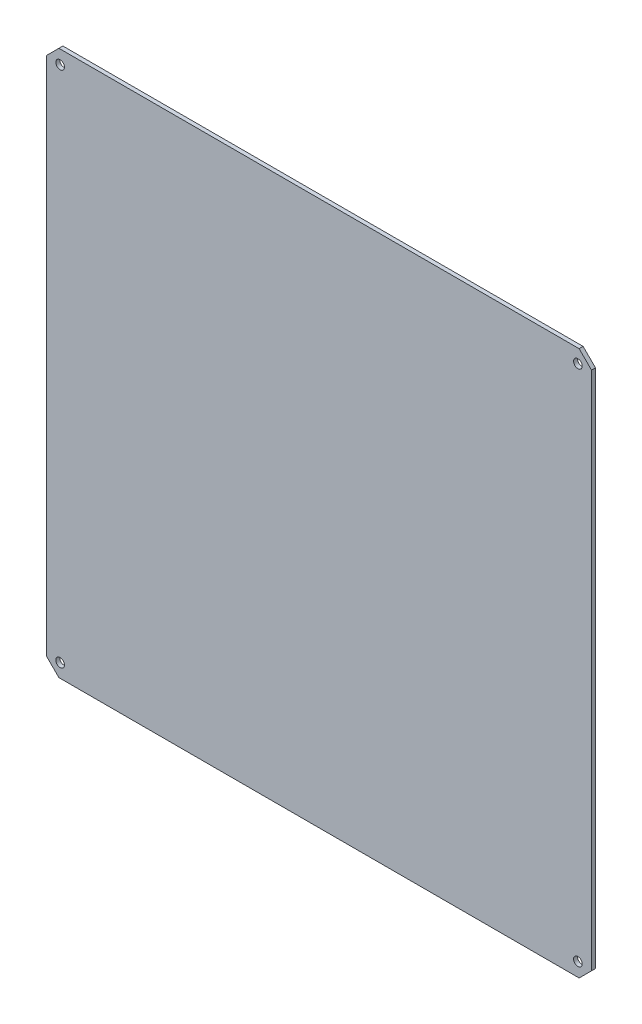
ISO-10303-21;
HEADER;
FILE_DESCRIPTION(('STEP AP214'),'2;1');
FILE_NAME('part.step','',(''),(''),'','','');
FILE_SCHEMA(('AUTOMOTIVE_DESIGN { 1 0 10303 214 1 1 1 1 }'));
ENDSEC;
DATA;
#1=APPLICATION_CONTEXT('core data for automotive mechanical design processes');
#2=APPLICATION_PROTOCOL_DEFINITION('international standard','automotive_design',2000,#1);
#3=PRODUCT_CONTEXT('',#1,'mechanical');
#4=PRODUCT('Part','Part','',(#3));
#5=PRODUCT_RELATED_PRODUCT_CATEGORY('part','',(#4));
#6=PRODUCT_DEFINITION_FORMATION('','',#4);
#7=PRODUCT_DEFINITION_CONTEXT('part definition',#1,'design');
#8=PRODUCT_DEFINITION('design','',#6,#7);
#9=PRODUCT_DEFINITION_SHAPE('','',#8);
#10=(LENGTH_UNIT() NAMED_UNIT(*) SI_UNIT(.MILLI.,.METRE.));
#11=(NAMED_UNIT(*) PLANE_ANGLE_UNIT() SI_UNIT($,.RADIAN.));
#12=(NAMED_UNIT(*) SI_UNIT($,.STERADIAN.) SOLID_ANGLE_UNIT());
#13=UNCERTAINTY_MEASURE_WITH_UNIT(LENGTH_MEASURE(1.E-05),#10,'distance_accuracy_value','');
#14=(GEOMETRIC_REPRESENTATION_CONTEXT(3) GLOBAL_UNCERTAINTY_ASSIGNED_CONTEXT((#13)) GLOBAL_UNIT_ASSIGNED_CONTEXT((#10,
#11,#12)) REPRESENTATION_CONTEXT('',''));
#15=CARTESIAN_POINT('',(0.,0.,0.));
#16=DIRECTION('',(0.,0.,1.));
#17=DIRECTION('',(1.,0.,0.));
#18=AXIS2_PLACEMENT_3D('',#15,#16,#17);
#19=CARTESIAN_POINT('',(0.,0.,1.6));
#20=DIRECTION('',(0.,0.,-1.));
#21=DIRECTION('',(-1.,0.,0.));
#22=AXIS2_PLACEMENT_3D('',#19,#20,#21);
#23=PLANE('',#22);
#24=DIRECTION('',(0.,-1.,0.));
#25=VECTOR('',#24,1.);
#26=CARTESIAN_POINT('',(-110.,-110.,1.6));
#27=LINE('',#26,#25);
#28=CARTESIAN_POINT('',(-110.,105.,1.6));
#29=VERTEX_POINT('',#28);
#30=CARTESIAN_POINT('',(-110.,-105.,1.6));
#31=VERTEX_POINT('',#30);
#32=EDGE_CURVE('E165',#29,#31,#27,.T.);
#33=ORIENTED_EDGE('',*,*,#32,.T.);
#34=DIRECTION('',(-0.707106781186546,0.707106781186549,0.));
#35=VECTOR('',#34,1.);
#36=CARTESIAN_POINT('',(-105.,-110.,1.6));
#37=LINE('',#36,#35);
#38=CARTESIAN_POINT('',(-105.,-110.,1.6));
#39=VERTEX_POINT('',#38);
#40=EDGE_CURVE('E148',#31,#39,#37,.F.);
#41=ORIENTED_EDGE('',*,*,#40,.T.);
#42=DIRECTION('',(1.,0.,0.));
#43=VECTOR('',#42,1.);
#44=CARTESIAN_POINT('',(-110.,-110.,1.6));
#45=LINE('',#44,#43);
#46=CARTESIAN_POINT('',(105.,-110.,1.6));
#47=VERTEX_POINT('',#46);
#48=EDGE_CURVE('E119',#39,#47,#45,.T.);
#49=ORIENTED_EDGE('',*,*,#48,.T.);
#50=DIRECTION('',(-0.70710678118655,-0.707106781186545,0.));
#51=VECTOR('',#50,1.);
#52=CARTESIAN_POINT('',(110.,-105.,1.6));
#53=LINE('',#52,#51);
#54=CARTESIAN_POINT('',(110.,-105.,1.6));
#55=VERTEX_POINT('',#54);
#56=EDGE_CURVE('E146',#47,#55,#53,.F.);
#57=ORIENTED_EDGE('',*,*,#56,.T.);
#58=DIRECTION('',(0.,1.,0.));
#59=VECTOR('',#58,1.);
#60=CARTESIAN_POINT('',(110.,-110.,1.6));
#61=LINE('',#60,#59);
#62=CARTESIAN_POINT('',(110.,105.,1.6));
#63=VERTEX_POINT('',#62);
#64=EDGE_CURVE('E126',#55,#63,#61,.T.);
#65=ORIENTED_EDGE('',*,*,#64,.T.);
#66=DIRECTION('',(0.707106781186546,-0.707106781186549,0.));
#67=VECTOR('',#66,1.);
#68=CARTESIAN_POINT('',(105.,110.,1.6));
#69=LINE('',#68,#67);
#70=CARTESIAN_POINT('',(105.,110.,1.6));
#71=VERTEX_POINT('',#70);
#72=EDGE_CURVE('E54',#63,#71,#69,.F.);
#73=ORIENTED_EDGE('',*,*,#72,.T.);
#74=DIRECTION('',(-1.,0.,0.));
#75=VECTOR('',#74,1.);
#76=CARTESIAN_POINT('',(-110.,110.,1.6));
#77=LINE('',#76,#75);
#78=CARTESIAN_POINT('',(-105.,110.,1.6));
#79=VERTEX_POINT('',#78);
#80=EDGE_CURVE('E129',#71,#79,#77,.T.);
#81=ORIENTED_EDGE('',*,*,#80,.T.);
#82=DIRECTION('',(0.707106781186549,0.707106781186546,0.));
#83=VECTOR('',#82,1.);
#84=CARTESIAN_POINT('',(-110.,105.,1.6));
#85=LINE('',#84,#83);
#86=EDGE_CURVE('E144',#79,#29,#85,.F.);
#87=ORIENTED_EDGE('',*,*,#86,.T.);
#88=EDGE_LOOP('',(#33,#41,#49,#57,#65,#73,#81,#87));
#89=FACE_BOUND('',#88,.T.);
#90=CARTESIAN_POINT('',(104.5,104.5,1.6));
#91=DIRECTION('',(0.,0.,1.));
#92=DIRECTION('',(1.,0.,0.));
#93=AXIS2_PLACEMENT_3D('',#90,#91,#92);
#94=CIRCLE('',#93,1.75);
#95=CARTESIAN_POINT('',(106.25,104.5,1.6));
#96=VERTEX_POINT('',#95);
#97=EDGE_CURVE('E161',#96,#96,#94,.T.);
#98=ORIENTED_EDGE('',*,*,#97,.F.);
#99=EDGE_LOOP('',(#98));
#100=FACE_BOUND('',#99,.T.);
#101=CARTESIAN_POINT('',(-104.5,104.5,1.6));
#102=DIRECTION('',(0.,0.,1.));
#103=DIRECTION('',(1.,0.,0.));
#104=AXIS2_PLACEMENT_3D('',#101,#102,#103);
#105=CIRCLE('',#104,1.75);
#106=CARTESIAN_POINT('',(-102.75,104.5,1.6));
#107=VERTEX_POINT('',#106);
#108=EDGE_CURVE('E172',#107,#107,#105,.T.);
#109=ORIENTED_EDGE('',*,*,#108,.F.);
#110=EDGE_LOOP('',(#109));
#111=FACE_BOUND('',#110,.T.);
#112=CARTESIAN_POINT('',(-104.5,-104.5,1.6));
#113=DIRECTION('',(0.,0.,1.));
#114=DIRECTION('',(1.,0.,0.));
#115=AXIS2_PLACEMENT_3D('',#112,#113,#114);
#116=CIRCLE('',#115,1.75);
#117=CARTESIAN_POINT('',(-102.75,-104.5,1.6));
#118=VERTEX_POINT('',#117);
#119=EDGE_CURVE('E178',#118,#118,#116,.T.);
#120=ORIENTED_EDGE('',*,*,#119,.F.);
#121=EDGE_LOOP('',(#120));
#122=FACE_BOUND('',#121,.T.);
#123=CARTESIAN_POINT('',(104.5,-104.5,1.6));
#124=DIRECTION('',(0.,0.,1.));
#125=DIRECTION('',(1.,0.,0.));
#126=AXIS2_PLACEMENT_3D('',#123,#124,#125);
#127=CIRCLE('',#126,1.75);
#128=CARTESIAN_POINT('',(106.25,-104.5,1.6));
#129=VERTEX_POINT('',#128);
#130=EDGE_CURVE('E184',#129,#129,#127,.T.);
#131=ORIENTED_EDGE('',*,*,#130,.F.);
#132=EDGE_LOOP('',(#131));
#133=FACE_BOUND('',#132,.T.);
#134=ADVANCED_FACE('F34',(#89,#100,#111,#122,#133),#23,.F.);
#135=CARTESIAN_POINT('',(0.,0.,0.));
#136=DIRECTION('',(0.,0.,-1.));
#137=DIRECTION('',(-1.,0.,0.));
#138=AXIS2_PLACEMENT_3D('',#135,#136,#137);
#139=PLANE('',#138);
#140=CARTESIAN_POINT('',(-104.5,-104.5,0.));
#141=DIRECTION('',(0.,0.,1.));
#142=DIRECTION('',(1.,0.,0.));
#143=AXIS2_PLACEMENT_3D('',#140,#141,#142);
#144=CIRCLE('',#143,1.75);
#145=CARTESIAN_POINT('',(-102.75,-104.5,0.));
#146=VERTEX_POINT('',#145);
#147=EDGE_CURVE('E181',#146,#146,#144,.T.);
#148=ORIENTED_EDGE('',*,*,#147,.T.);
#149=EDGE_LOOP('',(#148));
#150=FACE_BOUND('',#149,.T.);
#151=CARTESIAN_POINT('',(104.5,104.5,0.));
#152=DIRECTION('',(0.,0.,1.));
#153=DIRECTION('',(1.,0.,0.));
#154=AXIS2_PLACEMENT_3D('',#151,#152,#153);
#155=CIRCLE('',#154,1.75);
#156=CARTESIAN_POINT('',(106.25,104.5,0.));
#157=VERTEX_POINT('',#156);
#158=EDGE_CURVE('E169',#157,#157,#155,.T.);
#159=ORIENTED_EDGE('',*,*,#158,.T.);
#160=EDGE_LOOP('',(#159));
#161=FACE_BOUND('',#160,.T.);
#162=DIRECTION('',(1.,0.,0.));
#163=VECTOR('',#162,1.);
#164=CARTESIAN_POINT('',(-110.,-110.,0.));
#165=LINE('',#164,#163);
#166=CARTESIAN_POINT('',(-105.,-110.,0.));
#167=VERTEX_POINT('',#166);
#168=CARTESIAN_POINT('',(105.,-110.,0.));
#169=VERTEX_POINT('',#168);
#170=EDGE_CURVE('E116',#167,#169,#165,.T.);
#171=ORIENTED_EDGE('',*,*,#170,.F.);
#172=DIRECTION('',(0.707106781186546,-0.707106781186549,0.));
#173=VECTOR('',#172,1.);
#174=CARTESIAN_POINT('',(-107.5,-107.5,0.));
#175=LINE('',#174,#173);
#176=CARTESIAN_POINT('',(-110.,-105.,0.));
#177=VERTEX_POINT('',#176);
#178=EDGE_CURVE('E99',#167,#177,#175,.F.);
#179=ORIENTED_EDGE('',*,*,#178,.T.);
#180=DIRECTION('',(0.,-1.,0.));
#181=VECTOR('',#180,1.);
#182=CARTESIAN_POINT('',(-110.,-110.,0.));
#183=LINE('',#182,#181);
#184=CARTESIAN_POINT('',(-110.,105.,0.));
#185=VERTEX_POINT('',#184);
#186=EDGE_CURVE('E127',#185,#177,#183,.T.);
#187=ORIENTED_EDGE('',*,*,#186,.F.);
#188=DIRECTION('',(-0.707106781186549,-0.707106781186546,0.));
#189=VECTOR('',#188,1.);
#190=CARTESIAN_POINT('',(-107.5,107.5,0.));
#191=LINE('',#190,#189);
#192=CARTESIAN_POINT('',(-105.,110.,0.));
#193=VERTEX_POINT('',#192);
#194=EDGE_CURVE('E137',#185,#193,#191,.F.);
#195=ORIENTED_EDGE('',*,*,#194,.T.);
#196=DIRECTION('',(-1.,0.,0.));
#197=VECTOR('',#196,1.);
#198=CARTESIAN_POINT('',(-110.,110.,0.));
#199=LINE('',#198,#197);
#200=CARTESIAN_POINT('',(105.,110.,0.));
#201=VERTEX_POINT('',#200);
#202=EDGE_CURVE('E131',#201,#193,#199,.T.);
#203=ORIENTED_EDGE('',*,*,#202,.F.);
#204=DIRECTION('',(-0.707106781186546,0.707106781186549,0.));
#205=VECTOR('',#204,1.);
#206=CARTESIAN_POINT('',(107.5,107.5,0.));
#207=LINE('',#206,#205);
#208=CARTESIAN_POINT('',(110.,105.,0.));
#209=VERTEX_POINT('',#208);
#210=EDGE_CURVE('E120',#201,#209,#207,.F.);
#211=ORIENTED_EDGE('',*,*,#210,.T.);
#212=DIRECTION('',(0.,1.,0.));
#213=VECTOR('',#212,1.);
#214=CARTESIAN_POINT('',(110.,-110.,0.));
#215=LINE('',#214,#213);
#216=CARTESIAN_POINT('',(110.,-105.,0.));
#217=VERTEX_POINT('',#216);
#218=EDGE_CURVE('E160',#217,#209,#215,.T.);
#219=ORIENTED_EDGE('',*,*,#218,.F.);
#220=DIRECTION('',(0.70710678118655,0.707106781186545,0.));
#221=VECTOR('',#220,1.);
#222=CARTESIAN_POINT('',(107.5,-107.5,0.));
#223=LINE('',#222,#221);
#224=EDGE_CURVE('E110',#217,#169,#223,.F.);
#225=ORIENTED_EDGE('',*,*,#224,.T.);
#226=EDGE_LOOP('',(#171,#179,#187,#195,#203,#211,#219,#225));
#227=FACE_BOUND('',#226,.T.);
#228=CARTESIAN_POINT('',(-104.5,104.5,0.));
#229=DIRECTION('',(0.,0.,1.));
#230=DIRECTION('',(1.,0.,0.));
#231=AXIS2_PLACEMENT_3D('',#228,#229,#230);
#232=CIRCLE('',#231,1.75);
#233=CARTESIAN_POINT('',(-102.75,104.5,0.));
#234=VERTEX_POINT('',#233);
#235=EDGE_CURVE('E175',#234,#234,#232,.T.);
#236=ORIENTED_EDGE('',*,*,#235,.T.);
#237=EDGE_LOOP('',(#236));
#238=FACE_BOUND('',#237,.T.);
#239=CARTESIAN_POINT('',(104.5,-104.5,0.));
#240=DIRECTION('',(0.,0.,1.));
#241=DIRECTION('',(1.,0.,0.));
#242=AXIS2_PLACEMENT_3D('',#239,#240,#241);
#243=CIRCLE('',#242,1.75);
#244=CARTESIAN_POINT('',(106.25,-104.5,0.));
#245=VERTEX_POINT('',#244);
#246=EDGE_CURVE('E187',#245,#245,#243,.T.);
#247=ORIENTED_EDGE('',*,*,#246,.T.);
#248=EDGE_LOOP('',(#247));
#249=FACE_BOUND('',#248,.T.);
#250=ADVANCED_FACE('F123',(#150,#161,#227,#238,#249),#139,.T.);
#251=CARTESIAN_POINT('',(110.,-110.,1.6));
#252=DIRECTION('',(-1.,0.,0.));
#253=DIRECTION('',(0.,-1.,0.));
#254=AXIS2_PLACEMENT_3D('',#251,#252,#253);
#255=PLANE('',#254);
#256=ORIENTED_EDGE('',*,*,#64,.F.);
#257=DIRECTION('',(0.,0.,-1.));
#258=VECTOR('',#257,1.);
#259=CARTESIAN_POINT('',(110.,-105.,1.6));
#260=LINE('',#259,#258);
#261=EDGE_CURVE('E152',#55,#217,#260,.T.);
#262=ORIENTED_EDGE('',*,*,#261,.T.);
#263=ORIENTED_EDGE('',*,*,#218,.T.);
#264=DIRECTION('',(0.,0.,1.));
#265=VECTOR('',#264,1.);
#266=CARTESIAN_POINT('',(110.,105.,1.6));
#267=LINE('',#266,#265);
#268=EDGE_CURVE('E150',#209,#63,#267,.T.);
#269=ORIENTED_EDGE('',*,*,#268,.T.);
#270=EDGE_LOOP('',(#256,#262,#263,#269));
#271=FACE_BOUND('',#270,.T.);
#272=ADVANCED_FACE('F201',(#271),#255,.F.);
#273=CARTESIAN_POINT('',(-110.,110.,1.6));
#274=DIRECTION('',(0.,-1.,0.));
#275=DIRECTION('',(1.,0.,0.));
#276=AXIS2_PLACEMENT_3D('',#273,#274,#275);
#277=PLANE('',#276);
#278=ORIENTED_EDGE('',*,*,#202,.T.);
#279=DIRECTION('',(0.,0.,1.));
#280=VECTOR('',#279,1.);
#281=CARTESIAN_POINT('',(-105.,110.,1.6));
#282=LINE('',#281,#280);
#283=EDGE_CURVE('E11',#193,#79,#282,.T.);
#284=ORIENTED_EDGE('',*,*,#283,.T.);
#285=ORIENTED_EDGE('',*,*,#80,.F.);
#286=DIRECTION('',(0.,0.,-1.));
#287=VECTOR('',#286,1.);
#288=CARTESIAN_POINT('',(105.,110.,1.6));
#289=LINE('',#288,#287);
#290=EDGE_CURVE('E42',#71,#201,#289,.T.);
#291=ORIENTED_EDGE('',*,*,#290,.T.);
#292=EDGE_LOOP('',(#278,#284,#285,#291));
#293=FACE_BOUND('',#292,.T.);
#294=ADVANCED_FACE('F157',(#293),#277,.F.);
#295=CARTESIAN_POINT('',(-110.,-110.,1.6));
#296=DIRECTION('',(1.,0.,0.));
#297=DIRECTION('',(0.,0.,-1.));
#298=AXIS2_PLACEMENT_3D('',#295,#296,#297);
#299=PLANE('',#298);
#300=ORIENTED_EDGE('',*,*,#186,.T.);
#301=DIRECTION('',(0.,0.,1.));
#302=VECTOR('',#301,1.);
#303=CARTESIAN_POINT('',(-110.,-105.,1.6));
#304=LINE('',#303,#302);
#305=EDGE_CURVE('E104',#177,#31,#304,.T.);
#306=ORIENTED_EDGE('',*,*,#305,.T.);
#307=ORIENTED_EDGE('',*,*,#32,.F.);
#308=DIRECTION('',(0.,0.,-1.));
#309=VECTOR('',#308,1.);
#310=CARTESIAN_POINT('',(-110.,105.,1.6));
#311=LINE('',#310,#309);
#312=EDGE_CURVE('E109',#29,#185,#311,.T.);
#313=ORIENTED_EDGE('',*,*,#312,.T.);
#314=EDGE_LOOP('',(#300,#306,#307,#313));
#315=FACE_BOUND('',#314,.T.);
#316=ADVANCED_FACE('F211',(#315),#299,.F.);
#317=CARTESIAN_POINT('',(-110.,-110.,1.6));
#318=DIRECTION('',(0.,1.,0.));
#319=DIRECTION('',(0.,0.,1.));
#320=AXIS2_PLACEMENT_3D('',#317,#318,#319);
#321=PLANE('',#320);
#322=ORIENTED_EDGE('',*,*,#48,.F.);
#323=DIRECTION('',(0.,0.,-1.));
#324=VECTOR('',#323,1.);
#325=CARTESIAN_POINT('',(-105.,-110.,1.6));
#326=LINE('',#325,#324);
#327=EDGE_CURVE('E103',#39,#167,#326,.T.);
#328=ORIENTED_EDGE('',*,*,#327,.T.);
#329=ORIENTED_EDGE('',*,*,#170,.T.);
#330=DIRECTION('',(0.,0.,1.));
#331=VECTOR('',#330,1.);
#332=CARTESIAN_POINT('',(105.,-110.,1.6));
#333=LINE('',#332,#331);
#334=EDGE_CURVE('E121',#169,#47,#333,.T.);
#335=ORIENTED_EDGE('',*,*,#334,.T.);
#336=EDGE_LOOP('',(#322,#328,#329,#335));
#337=FACE_BOUND('',#336,.T.);
#338=ADVANCED_FACE('F115',(#337),#321,.F.);
#339=CARTESIAN_POINT('',(104.5,104.5,1.6));
#340=DIRECTION('',(0.,0.,-1.));
#341=DIRECTION('',(-1.,0.,0.));
#342=AXIS2_PLACEMENT_3D('',#339,#340,#341);
#343=CYLINDRICAL_SURFACE('',#342,1.75);
#344=ORIENTED_EDGE('',*,*,#97,.T.);
#345=EDGE_LOOP('',(#344));
#346=FACE_BOUND('',#345,.T.);
#347=ORIENTED_EDGE('',*,*,#158,.F.);
#348=EDGE_LOOP('',(#347));
#349=FACE_BOUND('',#348,.T.);
#350=ADVANCED_FACE('F206',(#346,#349),#343,.F.);
#351=CARTESIAN_POINT('',(-104.5,104.5,1.6));
#352=DIRECTION('',(0.,0.,-1.));
#353=DIRECTION('',(-1.,0.,0.));
#354=AXIS2_PLACEMENT_3D('',#351,#352,#353);
#355=CYLINDRICAL_SURFACE('',#354,1.75);
#356=ORIENTED_EDGE('',*,*,#108,.T.);
#357=EDGE_LOOP('',(#356));
#358=FACE_BOUND('',#357,.T.);
#359=ORIENTED_EDGE('',*,*,#235,.F.);
#360=EDGE_LOOP('',(#359));
#361=FACE_BOUND('',#360,.T.);
#362=ADVANCED_FACE('F310',(#358,#361),#355,.F.);
#363=CARTESIAN_POINT('',(-104.5,-104.5,1.6));
#364=DIRECTION('',(0.,0.,-1.));
#365=DIRECTION('',(-1.,0.,0.));
#366=AXIS2_PLACEMENT_3D('',#363,#364,#365);
#367=CYLINDRICAL_SURFACE('',#366,1.75);
#368=ORIENTED_EDGE('',*,*,#119,.T.);
#369=EDGE_LOOP('',(#368));
#370=FACE_BOUND('',#369,.T.);
#371=ORIENTED_EDGE('',*,*,#147,.F.);
#372=EDGE_LOOP('',(#371));
#373=FACE_BOUND('',#372,.T.);
#374=ADVANCED_FACE('F301',(#370,#373),#367,.F.);
#375=CARTESIAN_POINT('',(104.5,-104.5,1.6));
#376=DIRECTION('',(0.,0.,-1.));
#377=DIRECTION('',(-1.,0.,0.));
#378=AXIS2_PLACEMENT_3D('',#375,#376,#377);
#379=CYLINDRICAL_SURFACE('',#378,1.75);
#380=ORIENTED_EDGE('',*,*,#130,.T.);
#381=EDGE_LOOP('',(#380));
#382=FACE_BOUND('',#381,.T.);
#383=ORIENTED_EDGE('',*,*,#246,.F.);
#384=EDGE_LOOP('',(#383));
#385=FACE_BOUND('',#384,.T.);
#386=ADVANCED_FACE('F193',(#382,#385),#379,.F.);
#387=CARTESIAN_POINT('',(-105.,-110.,1.6));
#388=DIRECTION('',(0.707106781186549,0.707106781186546,0.));
#389=DIRECTION('',(0.,0.,-1.));
#390=AXIS2_PLACEMENT_3D('',#387,#388,#389);
#391=PLANE('',#390);
#392=ORIENTED_EDGE('',*,*,#40,.F.);
#393=ORIENTED_EDGE('',*,*,#305,.F.);
#394=ORIENTED_EDGE('',*,*,#178,.F.);
#395=ORIENTED_EDGE('',*,*,#327,.F.);
#396=EDGE_LOOP('',(#392,#393,#394,#395));
#397=FACE_BOUND('',#396,.T.);
#398=ADVANCED_FACE('F102',(#397),#391,.F.);
#399=CARTESIAN_POINT('',(110.,-105.,1.6));
#400=DIRECTION('',(-0.707106781186545,0.70710678118655,0.));
#401=DIRECTION('',(0.,0.,-1.));
#402=AXIS2_PLACEMENT_3D('',#399,#400,#401);
#403=PLANE('',#402);
#404=ORIENTED_EDGE('',*,*,#56,.F.);
#405=ORIENTED_EDGE('',*,*,#334,.F.);
#406=ORIENTED_EDGE('',*,*,#224,.F.);
#407=ORIENTED_EDGE('',*,*,#261,.F.);
#408=EDGE_LOOP('',(#404,#405,#406,#407));
#409=FACE_BOUND('',#408,.T.);
#410=ADVANCED_FACE('F222',(#409),#403,.F.);
#411=CARTESIAN_POINT('',(-110.,105.,1.6));
#412=DIRECTION('',(0.707106781186546,-0.707106781186549,0.));
#413=DIRECTION('',(0.,0.,-1.));
#414=AXIS2_PLACEMENT_3D('',#411,#412,#413);
#415=PLANE('',#414);
#416=ORIENTED_EDGE('',*,*,#86,.F.);
#417=ORIENTED_EDGE('',*,*,#283,.F.);
#418=ORIENTED_EDGE('',*,*,#194,.F.);
#419=ORIENTED_EDGE('',*,*,#312,.F.);
#420=EDGE_LOOP('',(#416,#417,#418,#419));
#421=FACE_BOUND('',#420,.T.);
#422=ADVANCED_FACE('F224',(#421),#415,.F.);
#423=CARTESIAN_POINT('',(105.,110.,1.6));
#424=DIRECTION('',(-0.707106781186549,-0.707106781186546,0.));
#425=DIRECTION('',(0.,0.,-1.));
#426=AXIS2_PLACEMENT_3D('',#423,#424,#425);
#427=PLANE('',#426);
#428=ORIENTED_EDGE('',*,*,#72,.F.);
#429=ORIENTED_EDGE('',*,*,#268,.F.);
#430=ORIENTED_EDGE('',*,*,#210,.F.);
#431=ORIENTED_EDGE('',*,*,#290,.F.);
#432=EDGE_LOOP('',(#428,#429,#430,#431));
#433=FACE_BOUND('',#432,.T.);
#434=ADVANCED_FACE('F36',(#433),#427,.F.);
#435=CLOSED_SHELL('',(#134,#250,#272,#294,#316,#338,#350,#362,#374,#386,#398,#410,#422,#434));
#436=MANIFOLD_SOLID_BREP('B2',#435);
#437=ADVANCED_BREP_SHAPE_REPRESENTATION('',(#18,#436),#14);
#438=SHAPE_DEFINITION_REPRESENTATION(#9,#437);
ENDSEC;
END-ISO-10303-21;
